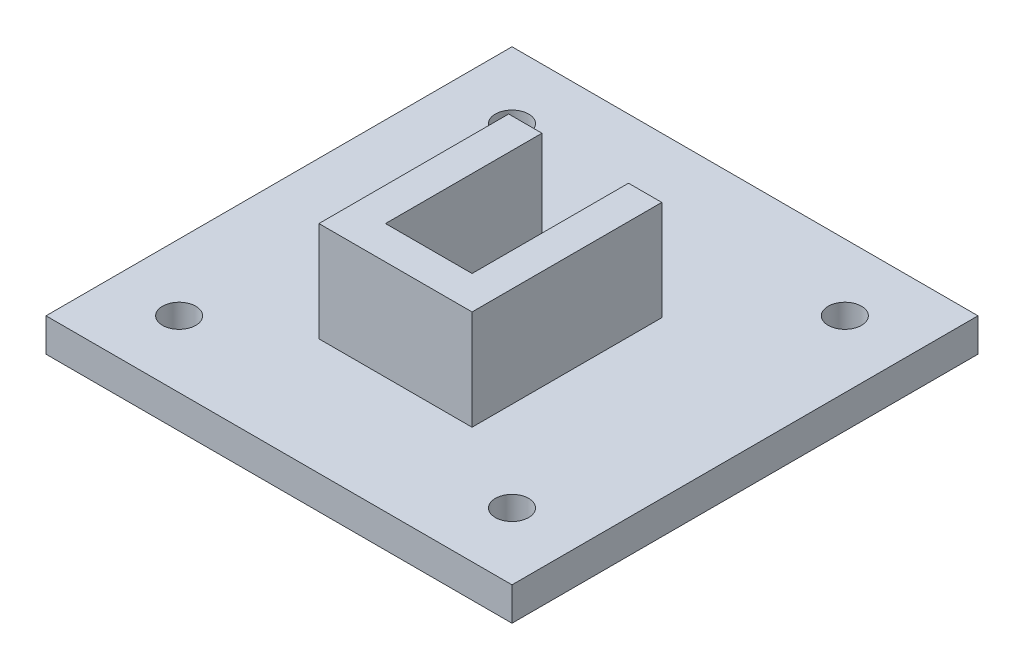
ISO-10303-21;
HEADER;
FILE_DESCRIPTION(('STEP AP214'),'2;1');
FILE_NAME('part.step','',(''),(''),'','','');
FILE_SCHEMA(('AUTOMOTIVE_DESIGN { 1 0 10303 214 1 1 1 1 }'));
ENDSEC;
DATA;
#1=APPLICATION_CONTEXT('core data for automotive mechanical design processes');
#2=APPLICATION_PROTOCOL_DEFINITION('international standard','automotive_design',2000,#1);
#3=PRODUCT_CONTEXT('',#1,'mechanical');
#4=PRODUCT('Part','Part','',(#3));
#5=PRODUCT_RELATED_PRODUCT_CATEGORY('part','',(#4));
#6=PRODUCT_DEFINITION_FORMATION('','',#4);
#7=PRODUCT_DEFINITION_CONTEXT('part definition',#1,'design');
#8=PRODUCT_DEFINITION('design','',#6,#7);
#9=PRODUCT_DEFINITION_SHAPE('','',#8);
#10=(LENGTH_UNIT() NAMED_UNIT(*) SI_UNIT(.MILLI.,.METRE.));
#11=(NAMED_UNIT(*) PLANE_ANGLE_UNIT() SI_UNIT($,.RADIAN.));
#12=(NAMED_UNIT(*) SI_UNIT($,.STERADIAN.) SOLID_ANGLE_UNIT());
#13=UNCERTAINTY_MEASURE_WITH_UNIT(LENGTH_MEASURE(1.E-05),#10,'distance_accuracy_value','');
#14=(GEOMETRIC_REPRESENTATION_CONTEXT(3) GLOBAL_UNCERTAINTY_ASSIGNED_CONTEXT((#13)) GLOBAL_UNIT_ASSIGNED_CONTEXT((#10,
#11,#12)) REPRESENTATION_CONTEXT('',''));
#15=CARTESIAN_POINT('',(0.,0.,0.));
#16=DIRECTION('',(0.,0.,1.));
#17=DIRECTION('',(1.,0.,0.));
#18=AXIS2_PLACEMENT_3D('',#15,#16,#17);
#19=CARTESIAN_POINT('',(35.,5.,-35.));
#20=DIRECTION('',(-1.,0.,0.));
#21=DIRECTION('',(0.,0.,1.));
#22=AXIS2_PLACEMENT_3D('',#19,#20,#21);
#23=PLANE('',#22);
#24=DIRECTION('',(0.,0.,-1.));
#25=VECTOR('',#24,1.);
#26=CARTESIAN_POINT('',(35.,0.,-35.));
#27=LINE('',#26,#25);
#28=CARTESIAN_POINT('',(35.,0.,35.));
#29=VERTEX_POINT('',#28);
#30=CARTESIAN_POINT('',(35.,0.,-35.));
#31=VERTEX_POINT('',#30);
#32=EDGE_CURVE('E208',#29,#31,#27,.T.);
#33=ORIENTED_EDGE('',*,*,#32,.T.);
#34=DIRECTION('',(0.,-1.,0.));
#35=VECTOR('',#34,1.);
#36=CARTESIAN_POINT('',(35.,5.,-35.));
#37=LINE('',#36,#35);
#38=CARTESIAN_POINT('',(35.,5.,-35.));
#39=VERTEX_POINT('',#38);
#40=EDGE_CURVE('E11',#39,#31,#37,.T.);
#41=ORIENTED_EDGE('',*,*,#40,.F.);
#42=DIRECTION('',(0.,0.,-1.));
#43=VECTOR('',#42,1.);
#44=CARTESIAN_POINT('',(35.,5.,-35.));
#45=LINE('',#44,#43);
#46=CARTESIAN_POINT('',(35.,5.,35.));
#47=VERTEX_POINT('',#46);
#48=EDGE_CURVE('E211',#47,#39,#45,.T.);
#49=ORIENTED_EDGE('',*,*,#48,.F.);
#50=DIRECTION('',(0.,-1.,0.));
#51=VECTOR('',#50,1.);
#52=CARTESIAN_POINT('',(35.,5.,35.));
#53=LINE('',#52,#51);
#54=EDGE_CURVE('E221',#47,#29,#53,.T.);
#55=ORIENTED_EDGE('',*,*,#54,.T.);
#56=EDGE_LOOP('',(#33,#41,#49,#55));
#57=FACE_BOUND('',#56,.T.);
#58=ADVANCED_FACE('F38',(#57),#23,.F.);
#59=CARTESIAN_POINT('',(-35.,5.,-35.));
#60=DIRECTION('',(0.,0.,1.));
#61=DIRECTION('',(1.,0.,0.));
#62=AXIS2_PLACEMENT_3D('',#59,#60,#61);
#63=PLANE('',#62);
#64=DIRECTION('',(-1.,0.,0.));
#65=VECTOR('',#64,1.);
#66=CARTESIAN_POINT('',(-35.,0.,-35.));
#67=LINE('',#66,#65);
#68=CARTESIAN_POINT('',(-35.,0.,-35.));
#69=VERTEX_POINT('',#68);
#70=EDGE_CURVE('E224',#31,#69,#67,.T.);
#71=ORIENTED_EDGE('',*,*,#70,.T.);
#72=DIRECTION('',(0.,-1.,0.));
#73=VECTOR('',#72,1.);
#74=CARTESIAN_POINT('',(-35.,5.,-35.));
#75=LINE('',#74,#73);
#76=CARTESIAN_POINT('',(-35.,5.,-35.));
#77=VERTEX_POINT('',#76);
#78=EDGE_CURVE('E45',#77,#69,#75,.T.);
#79=ORIENTED_EDGE('',*,*,#78,.F.);
#80=DIRECTION('',(-1.,0.,0.));
#81=VECTOR('',#80,1.);
#82=CARTESIAN_POINT('',(-35.,5.,-35.));
#83=LINE('',#82,#81);
#84=EDGE_CURVE('E214',#39,#77,#83,.T.);
#85=ORIENTED_EDGE('',*,*,#84,.F.);
#86=ORIENTED_EDGE('',*,*,#40,.T.);
#87=EDGE_LOOP('',(#71,#79,#85,#86));
#88=FACE_BOUND('',#87,.T.);
#89=ADVANCED_FACE('F253',(#88),#63,.F.);
#90=CARTESIAN_POINT('',(-35.,5.,-35.));
#91=DIRECTION('',(1.,0.,0.));
#92=DIRECTION('',(0.,0.,-1.));
#93=AXIS2_PLACEMENT_3D('',#90,#91,#92);
#94=PLANE('',#93);
#95=DIRECTION('',(0.,0.,1.));
#96=VECTOR('',#95,1.);
#97=CARTESIAN_POINT('',(-35.,0.,-35.));
#98=LINE('',#97,#96);
#99=CARTESIAN_POINT('',(-35.,0.,35.));
#100=VERTEX_POINT('',#99);
#101=EDGE_CURVE('E226',#69,#100,#98,.T.);
#102=ORIENTED_EDGE('',*,*,#101,.T.);
#103=DIRECTION('',(0.,-1.,0.));
#104=VECTOR('',#103,1.);
#105=CARTESIAN_POINT('',(-35.,5.,35.));
#106=LINE('',#105,#104);
#107=CARTESIAN_POINT('',(-35.,5.,35.));
#108=VERTEX_POINT('',#107);
#109=EDGE_CURVE('E231',#108,#100,#106,.T.);
#110=ORIENTED_EDGE('',*,*,#109,.F.);
#111=DIRECTION('',(0.,0.,1.));
#112=VECTOR('',#111,1.);
#113=CARTESIAN_POINT('',(-35.,5.,-35.));
#114=LINE('',#113,#112);
#115=EDGE_CURVE('E217',#77,#108,#114,.T.);
#116=ORIENTED_EDGE('',*,*,#115,.F.);
#117=ORIENTED_EDGE('',*,*,#78,.T.);
#118=EDGE_LOOP('',(#102,#110,#116,#117));
#119=FACE_BOUND('',#118,.T.);
#120=ADVANCED_FACE('F238',(#119),#94,.F.);
#121=CARTESIAN_POINT('',(-35.,5.,35.));
#122=DIRECTION('',(0.,0.,-1.));
#123=DIRECTION('',(-1.,0.,0.));
#124=AXIS2_PLACEMENT_3D('',#121,#122,#123);
#125=PLANE('',#124);
#126=DIRECTION('',(1.,0.,0.));
#127=VECTOR('',#126,1.);
#128=CARTESIAN_POINT('',(-35.,0.,35.));
#129=LINE('',#128,#127);
#130=EDGE_CURVE('E215',#100,#29,#129,.T.);
#131=ORIENTED_EDGE('',*,*,#130,.T.);
#132=ORIENTED_EDGE('',*,*,#54,.F.);
#133=DIRECTION('',(1.,0.,0.));
#134=VECTOR('',#133,1.);
#135=CARTESIAN_POINT('',(-35.,5.,35.));
#136=LINE('',#135,#134);
#137=EDGE_CURVE('E219',#108,#47,#136,.T.);
#138=ORIENTED_EDGE('',*,*,#137,.F.);
#139=ORIENTED_EDGE('',*,*,#109,.T.);
#140=EDGE_LOOP('',(#131,#132,#138,#139));
#141=FACE_BOUND('',#140,.T.);
#142=ADVANCED_FACE('F247',(#141),#125,.F.);
#143=CARTESIAN_POINT('',(0.,5.,0.));
#144=DIRECTION('',(0.,1.,0.));
#145=DIRECTION('',(0.,0.,1.));
#146=AXIS2_PLACEMENT_3D('',#143,#144,#145);
#147=PLANE('',#146);
#148=DIRECTION('',(0.,0.,1.));
#149=VECTOR('',#148,1.);
#150=CARTESIAN_POINT('',(-11.5,5.,-17.5));
#151=LINE('',#150,#149);
#152=CARTESIAN_POINT('',(-11.5,5.,-11.));
#153=VERTEX_POINT('',#152);
#154=CARTESIAN_POINT('',(-11.5,5.,17.5));
#155=VERTEX_POINT('',#154);
#156=EDGE_CURVE('E178',#153,#155,#151,.T.);
#157=ORIENTED_EDGE('',*,*,#156,.F.);
#158=DIRECTION('',(1.,0.,0.));
#159=VECTOR('',#158,1.);
#160=CARTESIAN_POINT('',(-11.5,5.,-11.));
#161=LINE('',#160,#159);
#162=CARTESIAN_POINT('',(-6.5,5.,-11.));
#163=VERTEX_POINT('',#162);
#164=EDGE_CURVE('E52',#153,#163,#161,.T.);
#165=ORIENTED_EDGE('',*,*,#164,.T.);
#166=DIRECTION('',(0.,0.,1.));
#167=VECTOR('',#166,1.);
#168=CARTESIAN_POINT('',(-6.5,5.,-17.5));
#169=LINE('',#168,#167);
#170=CARTESIAN_POINT('',(-6.5,5.,12.5));
#171=VERTEX_POINT('',#170);
#172=EDGE_CURVE('E148',#163,#171,#169,.T.);
#173=ORIENTED_EDGE('',*,*,#172,.T.);
#174=DIRECTION('',(1.,0.,0.));
#175=VECTOR('',#174,1.);
#176=CARTESIAN_POINT('',(-6.5,5.,12.5));
#177=LINE('',#176,#175);
#178=CARTESIAN_POINT('',(6.5,5.,12.5));
#179=VERTEX_POINT('',#178);
#180=EDGE_CURVE('E147',#171,#179,#177,.T.);
#181=ORIENTED_EDGE('',*,*,#180,.T.);
#182=DIRECTION('',(0.,0.,-1.));
#183=VECTOR('',#182,1.);
#184=CARTESIAN_POINT('',(6.5,5.,-17.5));
#185=LINE('',#184,#183);
#186=CARTESIAN_POINT('',(6.5,5.,-11.));
#187=VERTEX_POINT('',#186);
#188=EDGE_CURVE('E139',#179,#187,#185,.T.);
#189=ORIENTED_EDGE('',*,*,#188,.T.);
#190=DIRECTION('',(1.,0.,0.));
#191=VECTOR('',#190,1.);
#192=CARTESIAN_POINT('',(6.5,5.,-11.));
#193=LINE('',#192,#191);
#194=CARTESIAN_POINT('',(11.5,5.,-11.));
#195=VERTEX_POINT('',#194);
#196=EDGE_CURVE('E125',#187,#195,#193,.T.);
#197=ORIENTED_EDGE('',*,*,#196,.T.);
#198=DIRECTION('',(0.,0.,-1.));
#199=VECTOR('',#198,1.);
#200=CARTESIAN_POINT('',(11.5,5.,-17.5));
#201=LINE('',#200,#199);
#202=CARTESIAN_POINT('',(11.5,5.,17.5));
#203=VERTEX_POINT('',#202);
#204=EDGE_CURVE('E59',#203,#195,#201,.T.);
#205=ORIENTED_EDGE('',*,*,#204,.F.);
#206=DIRECTION('',(1.,0.,0.));
#207=VECTOR('',#206,1.);
#208=CARTESIAN_POINT('',(-11.5,5.,17.5));
#209=LINE('',#208,#207);
#210=EDGE_CURVE('E172',#155,#203,#209,.T.);
#211=ORIENTED_EDGE('',*,*,#210,.F.);
#212=EDGE_LOOP('',(#157,#165,#173,#181,#189,#197,#205,#211));
#213=FACE_BOUND('',#212,.T.);
#214=CARTESIAN_POINT('',(25.,5.,25.));
#215=DIRECTION('',(0.,1.,0.));
#216=DIRECTION('',(0.,0.,1.));
#217=AXIS2_PLACEMENT_3D('',#214,#215,#216);
#218=CIRCLE('',#217,2.5);
#219=CARTESIAN_POINT('',(25.,5.,27.5));
#220=VERTEX_POINT('',#219);
#221=EDGE_CURVE('E186',#220,#220,#218,.T.);
#222=ORIENTED_EDGE('',*,*,#221,.F.);
#223=EDGE_LOOP('',(#222));
#224=FACE_BOUND('',#223,.T.);
#225=CARTESIAN_POINT('',(-25.,5.,25.));
#226=DIRECTION('',(0.,1.,0.));
#227=DIRECTION('',(0.,0.,1.));
#228=AXIS2_PLACEMENT_3D('',#225,#226,#227);
#229=CIRCLE('',#228,2.5);
#230=CARTESIAN_POINT('',(-25.,5.,27.5));
#231=VERTEX_POINT('',#230);
#232=EDGE_CURVE('E190',#231,#231,#229,.T.);
#233=ORIENTED_EDGE('',*,*,#232,.F.);
#234=EDGE_LOOP('',(#233));
#235=FACE_BOUND('',#234,.T.);
#236=CARTESIAN_POINT('',(25.,5.,-25.));
#237=DIRECTION('',(0.,1.,0.));
#238=DIRECTION('',(0.,0.,1.));
#239=AXIS2_PLACEMENT_3D('',#236,#237,#238);
#240=CIRCLE('',#239,2.5);
#241=CARTESIAN_POINT('',(25.,5.,-22.5));
#242=VERTEX_POINT('',#241);
#243=EDGE_CURVE('E196',#242,#242,#240,.T.);
#244=ORIENTED_EDGE('',*,*,#243,.F.);
#245=EDGE_LOOP('',(#244));
#246=FACE_BOUND('',#245,.T.);
#247=CARTESIAN_POINT('',(-25.,5.,-25.));
#248=DIRECTION('',(0.,1.,0.));
#249=DIRECTION('',(0.,0.,1.));
#250=AXIS2_PLACEMENT_3D('',#247,#248,#249);
#251=CIRCLE('',#250,2.5);
#252=CARTESIAN_POINT('',(-25.,5.,-22.5));
#253=VERTEX_POINT('',#252);
#254=EDGE_CURVE('E202',#253,#253,#251,.T.);
#255=ORIENTED_EDGE('',*,*,#254,.F.);
#256=EDGE_LOOP('',(#255));
#257=FACE_BOUND('',#256,.T.);
#258=ORIENTED_EDGE('',*,*,#48,.T.);
#259=ORIENTED_EDGE('',*,*,#84,.T.);
#260=ORIENTED_EDGE('',*,*,#115,.T.);
#261=ORIENTED_EDGE('',*,*,#137,.T.);
#262=EDGE_LOOP('',(#258,#259,#260,#261));
#263=FACE_BOUND('',#262,.T.);
#264=ADVANCED_FACE('F144',(#213,#224,#235,#246,#257,#263),#147,.T.);
#265=CARTESIAN_POINT('',(0.,0.,0.));
#266=DIRECTION('',(0.,1.,0.));
#267=DIRECTION('',(0.,0.,1.));
#268=AXIS2_PLACEMENT_3D('',#265,#266,#267);
#269=PLANE('',#268);
#270=CARTESIAN_POINT('',(25.,0.,25.));
#271=DIRECTION('',(0.,1.,0.));
#272=DIRECTION('',(0.,0.,1.));
#273=AXIS2_PLACEMENT_3D('',#270,#271,#272);
#274=CIRCLE('',#273,2.5);
#275=CARTESIAN_POINT('',(25.,0.,27.5));
#276=VERTEX_POINT('',#275);
#277=EDGE_CURVE('E187',#276,#276,#274,.T.);
#278=ORIENTED_EDGE('',*,*,#277,.T.);
#279=EDGE_LOOP('',(#278));
#280=FACE_BOUND('',#279,.T.);
#281=CARTESIAN_POINT('',(-25.,0.,25.));
#282=DIRECTION('',(0.,1.,0.));
#283=DIRECTION('',(0.,0.,1.));
#284=AXIS2_PLACEMENT_3D('',#281,#282,#283);
#285=CIRCLE('',#284,2.5);
#286=CARTESIAN_POINT('',(-25.,0.,27.5));
#287=VERTEX_POINT('',#286);
#288=EDGE_CURVE('E193',#287,#287,#285,.T.);
#289=ORIENTED_EDGE('',*,*,#288,.T.);
#290=EDGE_LOOP('',(#289));
#291=FACE_BOUND('',#290,.T.);
#292=CARTESIAN_POINT('',(25.,0.,-25.));
#293=DIRECTION('',(0.,1.,0.));
#294=DIRECTION('',(0.,0.,1.));
#295=AXIS2_PLACEMENT_3D('',#292,#293,#294);
#296=CIRCLE('',#295,2.5);
#297=CARTESIAN_POINT('',(25.,0.,-22.5));
#298=VERTEX_POINT('',#297);
#299=EDGE_CURVE('E199',#298,#298,#296,.T.);
#300=ORIENTED_EDGE('',*,*,#299,.T.);
#301=EDGE_LOOP('',(#300));
#302=FACE_BOUND('',#301,.T.);
#303=CARTESIAN_POINT('',(-25.,0.,-25.));
#304=DIRECTION('',(0.,1.,0.));
#305=DIRECTION('',(0.,0.,1.));
#306=AXIS2_PLACEMENT_3D('',#303,#304,#305);
#307=CIRCLE('',#306,2.5);
#308=CARTESIAN_POINT('',(-25.,0.,-22.5));
#309=VERTEX_POINT('',#308);
#310=EDGE_CURVE('E205',#309,#309,#307,.T.);
#311=ORIENTED_EDGE('',*,*,#310,.T.);
#312=EDGE_LOOP('',(#311));
#313=FACE_BOUND('',#312,.T.);
#314=ORIENTED_EDGE('',*,*,#32,.F.);
#315=ORIENTED_EDGE('',*,*,#130,.F.);
#316=ORIENTED_EDGE('',*,*,#101,.F.);
#317=ORIENTED_EDGE('',*,*,#70,.F.);
#318=EDGE_LOOP('',(#314,#315,#316,#317));
#319=FACE_BOUND('',#318,.T.);
#320=ADVANCED_FACE('F244',(#280,#291,#302,#313,#319),#269,.F.);
#321=CARTESIAN_POINT('',(-25.,0.,-25.));
#322=DIRECTION('',(0.,1.,0.));
#323=DIRECTION('',(0.,0.,1.));
#324=AXIS2_PLACEMENT_3D('',#321,#322,#323);
#325=CYLINDRICAL_SURFACE('',#324,2.5);
#326=ORIENTED_EDGE('',*,*,#310,.F.);
#327=EDGE_LOOP('',(#326));
#328=FACE_BOUND('',#327,.T.);
#329=ORIENTED_EDGE('',*,*,#254,.T.);
#330=EDGE_LOOP('',(#329));
#331=FACE_BOUND('',#330,.T.);
#332=ADVANCED_FACE('F265',(#328,#331),#325,.F.);
#333=CARTESIAN_POINT('',(25.,0.,-25.));
#334=DIRECTION('',(0.,1.,0.));
#335=DIRECTION('',(0.,0.,1.));
#336=AXIS2_PLACEMENT_3D('',#333,#334,#335);
#337=CYLINDRICAL_SURFACE('',#336,2.5);
#338=ORIENTED_EDGE('',*,*,#299,.F.);
#339=EDGE_LOOP('',(#338));
#340=FACE_BOUND('',#339,.T.);
#341=ORIENTED_EDGE('',*,*,#243,.T.);
#342=EDGE_LOOP('',(#341));
#343=FACE_BOUND('',#342,.T.);
#344=ADVANCED_FACE('F271',(#340,#343),#337,.F.);
#345=CARTESIAN_POINT('',(-25.,0.,25.));
#346=DIRECTION('',(0.,1.,0.));
#347=DIRECTION('',(0.,0.,1.));
#348=AXIS2_PLACEMENT_3D('',#345,#346,#347);
#349=CYLINDRICAL_SURFACE('',#348,2.5);
#350=ORIENTED_EDGE('',*,*,#288,.F.);
#351=EDGE_LOOP('',(#350));
#352=FACE_BOUND('',#351,.T.);
#353=ORIENTED_EDGE('',*,*,#232,.T.);
#354=EDGE_LOOP('',(#353));
#355=FACE_BOUND('',#354,.T.);
#356=ADVANCED_FACE('F275',(#352,#355),#349,.F.);
#357=CARTESIAN_POINT('',(25.,0.,25.));
#358=DIRECTION('',(0.,1.,0.));
#359=DIRECTION('',(0.,0.,1.));
#360=AXIS2_PLACEMENT_3D('',#357,#358,#359);
#361=CYLINDRICAL_SURFACE('',#360,2.5);
#362=ORIENTED_EDGE('',*,*,#277,.F.);
#363=EDGE_LOOP('',(#362));
#364=FACE_BOUND('',#363,.T.);
#365=ORIENTED_EDGE('',*,*,#221,.T.);
#366=EDGE_LOOP('',(#365));
#367=FACE_BOUND('',#366,.T.);
#368=ADVANCED_FACE('F279',(#364,#367),#361,.F.);
#369=CARTESIAN_POINT('',(11.5,20.,-17.5));
#370=DIRECTION('',(-1.,0.,0.));
#371=DIRECTION('',(0.,0.,1.));
#372=AXIS2_PLACEMENT_3D('',#369,#370,#371);
#373=PLANE('',#372);
#374=ORIENTED_EDGE('',*,*,#204,.T.);
#375=DIRECTION('',(0.,1.,0.));
#376=VECTOR('',#375,1.);
#377=CARTESIAN_POINT('',(11.5,5.,-11.));
#378=LINE('',#377,#376);
#379=CARTESIAN_POINT('',(11.5,20.,-11.));
#380=VERTEX_POINT('',#379);
#381=EDGE_CURVE('E131',#195,#380,#378,.T.);
#382=ORIENTED_EDGE('',*,*,#381,.T.);
#383=DIRECTION('',(0.,0.,-1.));
#384=VECTOR('',#383,1.);
#385=CARTESIAN_POINT('',(11.5,20.,-17.5));
#386=LINE('',#385,#384);
#387=CARTESIAN_POINT('',(11.5,20.,17.5));
#388=VERTEX_POINT('',#387);
#389=EDGE_CURVE('E168',#388,#380,#386,.T.);
#390=ORIENTED_EDGE('',*,*,#389,.F.);
#391=DIRECTION('',(0.,-1.,0.));
#392=VECTOR('',#391,1.);
#393=CARTESIAN_POINT('',(11.5,20.,17.5));
#394=LINE('',#393,#392);
#395=EDGE_CURVE('E176',#388,#203,#394,.T.);
#396=ORIENTED_EDGE('',*,*,#395,.T.);
#397=EDGE_LOOP('',(#374,#382,#390,#396));
#398=FACE_BOUND('',#397,.T.);
#399=ADVANCED_FACE('F283',(#398),#373,.F.);
#400=CARTESIAN_POINT('',(-11.5,20.,-17.5));
#401=DIRECTION('',(1.,0.,0.));
#402=DIRECTION('',(0.,0.,-1.));
#403=AXIS2_PLACEMENT_3D('',#400,#401,#402);
#404=PLANE('',#403);
#405=DIRECTION('',(0.,0.,1.));
#406=VECTOR('',#405,1.);
#407=CARTESIAN_POINT('',(-11.5,20.,-17.5));
#408=LINE('',#407,#406);
#409=CARTESIAN_POINT('',(-11.5,20.,-11.));
#410=VERTEX_POINT('',#409);
#411=CARTESIAN_POINT('',(-11.5,20.,17.5));
#412=VERTEX_POINT('',#411);
#413=EDGE_CURVE('E171',#410,#412,#408,.T.);
#414=ORIENTED_EDGE('',*,*,#413,.F.);
#415=DIRECTION('',(0.,1.,0.));
#416=VECTOR('',#415,1.);
#417=CARTESIAN_POINT('',(-11.5,5.,-11.));
#418=LINE('',#417,#416);
#419=EDGE_CURVE('E156',#153,#410,#418,.T.);
#420=ORIENTED_EDGE('',*,*,#419,.F.);
#421=ORIENTED_EDGE('',*,*,#156,.T.);
#422=DIRECTION('',(0.,-1.,0.));
#423=VECTOR('',#422,1.);
#424=CARTESIAN_POINT('',(-11.5,20.,17.5));
#425=LINE('',#424,#423);
#426=EDGE_CURVE('E183',#412,#155,#425,.T.);
#427=ORIENTED_EDGE('',*,*,#426,.F.);
#428=EDGE_LOOP('',(#414,#420,#421,#427));
#429=FACE_BOUND('',#428,.T.);
#430=ADVANCED_FACE('F287',(#429),#404,.F.);
#431=CARTESIAN_POINT('',(-11.5,20.,17.5));
#432=DIRECTION('',(0.,0.,-1.));
#433=DIRECTION('',(-1.,0.,0.));
#434=AXIS2_PLACEMENT_3D('',#431,#432,#433);
#435=PLANE('',#434);
#436=ORIENTED_EDGE('',*,*,#210,.T.);
#437=ORIENTED_EDGE('',*,*,#395,.F.);
#438=DIRECTION('',(1.,0.,0.));
#439=VECTOR('',#438,1.);
#440=CARTESIAN_POINT('',(-11.5,20.,17.5));
#441=LINE('',#440,#439);
#442=EDGE_CURVE('E174',#412,#388,#441,.T.);
#443=ORIENTED_EDGE('',*,*,#442,.F.);
#444=ORIENTED_EDGE('',*,*,#426,.T.);
#445=EDGE_LOOP('',(#436,#437,#443,#444));
#446=FACE_BOUND('',#445,.T.);
#447=ADVANCED_FACE('F291',(#446),#435,.F.);
#448=CARTESIAN_POINT('',(0.,20.,0.));
#449=DIRECTION('',(0.,1.,0.));
#450=DIRECTION('',(0.,0.,1.));
#451=AXIS2_PLACEMENT_3D('',#448,#449,#450);
#452=PLANE('',#451);
#453=DIRECTION('',(1.,0.,0.));
#454=VECTOR('',#453,1.);
#455=CARTESIAN_POINT('',(6.5,20.,-11.));
#456=LINE('',#455,#454);
#457=CARTESIAN_POINT('',(6.5,20.,-11.));
#458=VERTEX_POINT('',#457);
#459=EDGE_CURVE('E133',#458,#380,#456,.T.);
#460=ORIENTED_EDGE('',*,*,#459,.F.);
#461=DIRECTION('',(0.,0.,-1.));
#462=VECTOR('',#461,1.);
#463=CARTESIAN_POINT('',(6.5,20.,-17.5));
#464=LINE('',#463,#462);
#465=CARTESIAN_POINT('',(6.5,20.,12.5));
#466=VERTEX_POINT('',#465);
#467=EDGE_CURVE('E142',#466,#458,#464,.T.);
#468=ORIENTED_EDGE('',*,*,#467,.F.);
#469=DIRECTION('',(1.,0.,0.));
#470=VECTOR('',#469,1.);
#471=CARTESIAN_POINT('',(-6.5,20.,12.5));
#472=LINE('',#471,#470);
#473=CARTESIAN_POINT('',(-6.5,20.,12.5));
#474=VERTEX_POINT('',#473);
#475=EDGE_CURVE('E149',#474,#466,#472,.T.);
#476=ORIENTED_EDGE('',*,*,#475,.F.);
#477=DIRECTION('',(0.,0.,1.));
#478=VECTOR('',#477,1.);
#479=CARTESIAN_POINT('',(-6.5,20.,-17.5));
#480=LINE('',#479,#478);
#481=CARTESIAN_POINT('',(-6.5,20.,-11.));
#482=VERTEX_POINT('',#481);
#483=EDGE_CURVE('E153',#482,#474,#480,.T.);
#484=ORIENTED_EDGE('',*,*,#483,.F.);
#485=DIRECTION('',(1.,0.,0.));
#486=VECTOR('',#485,1.);
#487=CARTESIAN_POINT('',(-11.5,20.,-11.));
#488=LINE('',#487,#486);
#489=EDGE_CURVE('E437',#410,#482,#488,.T.);
#490=ORIENTED_EDGE('',*,*,#489,.F.);
#491=ORIENTED_EDGE('',*,*,#413,.T.);
#492=ORIENTED_EDGE('',*,*,#442,.T.);
#493=ORIENTED_EDGE('',*,*,#389,.T.);
#494=EDGE_LOOP('',(#460,#468,#476,#484,#490,#491,#492,#493));
#495=FACE_BOUND('',#494,.T.);
#496=ADVANCED_FACE('F295',(#495),#452,.T.);
#497=CARTESIAN_POINT('',(6.5,5.,-17.5));
#498=DIRECTION('',(1.,0.,0.));
#499=DIRECTION('',(0.,0.,-1.));
#500=AXIS2_PLACEMENT_3D('',#497,#498,#499);
#501=PLANE('',#500);
#502=ORIENTED_EDGE('',*,*,#467,.T.);
#503=DIRECTION('',(0.,1.,0.));
#504=VECTOR('',#503,1.);
#505=CARTESIAN_POINT('',(6.5,5.,-11.));
#506=LINE('',#505,#504);
#507=EDGE_CURVE('E128',#187,#458,#506,.T.);
#508=ORIENTED_EDGE('',*,*,#507,.F.);
#509=ORIENTED_EDGE('',*,*,#188,.F.);
#510=DIRECTION('',(0.,1.,0.));
#511=VECTOR('',#510,1.);
#512=CARTESIAN_POINT('',(6.5,5.,12.5));
#513=LINE('',#512,#511);
#514=EDGE_CURVE('E164',#179,#466,#513,.T.);
#515=ORIENTED_EDGE('',*,*,#514,.T.);
#516=EDGE_LOOP('',(#502,#508,#509,#515));
#517=FACE_BOUND('',#516,.T.);
#518=ADVANCED_FACE('F138',(#517),#501,.F.);
#519=CARTESIAN_POINT('',(-6.5,5.,12.5));
#520=DIRECTION('',(0.,0.,1.));
#521=DIRECTION('',(1.,0.,0.));
#522=AXIS2_PLACEMENT_3D('',#519,#520,#521);
#523=PLANE('',#522);
#524=ORIENTED_EDGE('',*,*,#475,.T.);
#525=ORIENTED_EDGE('',*,*,#514,.F.);
#526=ORIENTED_EDGE('',*,*,#180,.F.);
#527=DIRECTION('',(0.,1.,0.));
#528=VECTOR('',#527,1.);
#529=CARTESIAN_POINT('',(-6.5,5.,12.5));
#530=LINE('',#529,#528);
#531=EDGE_CURVE('E160',#171,#474,#530,.T.);
#532=ORIENTED_EDGE('',*,*,#531,.T.);
#533=EDGE_LOOP('',(#524,#525,#526,#532));
#534=FACE_BOUND('',#533,.T.);
#535=ADVANCED_FACE('F302',(#534),#523,.F.);
#536=CARTESIAN_POINT('',(-6.5,5.,-17.5));
#537=DIRECTION('',(-1.,0.,0.));
#538=DIRECTION('',(0.,0.,1.));
#539=AXIS2_PLACEMENT_3D('',#536,#537,#538);
#540=PLANE('',#539);
#541=ORIENTED_EDGE('',*,*,#172,.F.);
#542=DIRECTION('',(0.,1.,0.));
#543=VECTOR('',#542,1.);
#544=CARTESIAN_POINT('',(-6.5,5.,-11.));
#545=LINE('',#544,#543);
#546=EDGE_CURVE('E162',#163,#482,#545,.T.);
#547=ORIENTED_EDGE('',*,*,#546,.T.);
#548=ORIENTED_EDGE('',*,*,#483,.T.);
#549=ORIENTED_EDGE('',*,*,#531,.F.);
#550=EDGE_LOOP('',(#541,#547,#548,#549));
#551=FACE_BOUND('',#550,.T.);
#552=ADVANCED_FACE('F303',(#551),#540,.F.);
#553=CARTESIAN_POINT('',(-11.5,5.,-11.));
#554=DIRECTION('',(0.,0.,1.));
#555=DIRECTION('',(1.,0.,0.));
#556=AXIS2_PLACEMENT_3D('',#553,#554,#555);
#557=PLANE('',#556);
#558=ORIENTED_EDGE('',*,*,#489,.T.);
#559=ORIENTED_EDGE('',*,*,#546,.F.);
#560=ORIENTED_EDGE('',*,*,#164,.F.);
#561=ORIENTED_EDGE('',*,*,#419,.T.);
#562=EDGE_LOOP('',(#558,#559,#560,#561));
#563=FACE_BOUND('',#562,.T.);
#564=ADVANCED_FACE('F306',(#563),#557,.F.);
#565=CARTESIAN_POINT('',(6.5,5.,-11.));
#566=DIRECTION('',(0.,0.,1.));
#567=DIRECTION('',(1.,0.,0.));
#568=AXIS2_PLACEMENT_3D('',#565,#566,#567);
#569=PLANE('',#568);
#570=ORIENTED_EDGE('',*,*,#459,.T.);
#571=ORIENTED_EDGE('',*,*,#381,.F.);
#572=ORIENTED_EDGE('',*,*,#196,.F.);
#573=ORIENTED_EDGE('',*,*,#507,.T.);
#574=EDGE_LOOP('',(#570,#571,#572,#573));
#575=FACE_BOUND('',#574,.T.);
#576=ADVANCED_FACE('F127',(#575),#569,.F.);
#577=CLOSED_SHELL('',(#58,#89,#120,#142,#264,#320,#332,#344,#356,#368,#399,#430,#447,#496,#518,
#535,#552,#564,#576));
#578=MANIFOLD_SOLID_BREP('B2',#577);
#579=ADVANCED_BREP_SHAPE_REPRESENTATION('',(#18,#578),#14);
#580=SHAPE_DEFINITION_REPRESENTATION(#9,#579);
ENDSEC;
END-ISO-10303-21;
